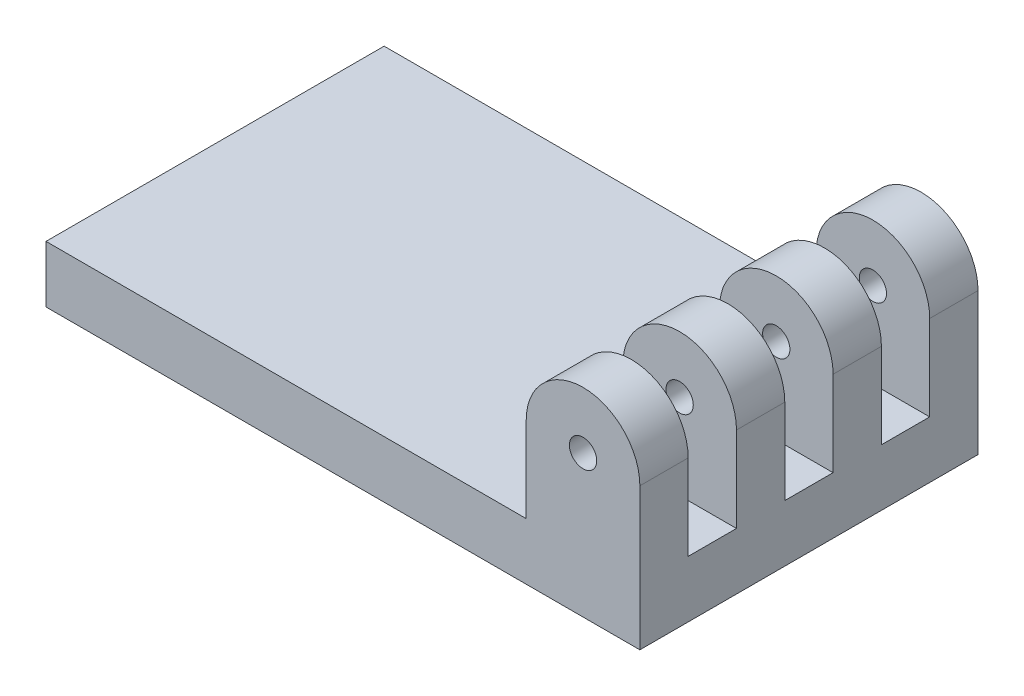
ISO-10303-21;
HEADER;
FILE_DESCRIPTION(('STEP AP214'),'2;1');
FILE_NAME('part.step','',(''),(''),'','','');
FILE_SCHEMA(('AUTOMOTIVE_DESIGN { 1 0 10303 214 1 1 1 1 }'));
ENDSEC;
DATA;
#1=APPLICATION_CONTEXT('core data for automotive mechanical design processes');
#2=APPLICATION_PROTOCOL_DEFINITION('international standard','automotive_design',2000,#1);
#3=PRODUCT_CONTEXT('',#1,'mechanical');
#4=PRODUCT('Part','Part','',(#3));
#5=PRODUCT_RELATED_PRODUCT_CATEGORY('part','',(#4));
#6=PRODUCT_DEFINITION_FORMATION('','',#4);
#7=PRODUCT_DEFINITION_CONTEXT('part definition',#1,'design');
#8=PRODUCT_DEFINITION('design','',#6,#7);
#9=PRODUCT_DEFINITION_SHAPE('','',#8);
#10=(LENGTH_UNIT() NAMED_UNIT(*) SI_UNIT(.MILLI.,.METRE.));
#11=(NAMED_UNIT(*) PLANE_ANGLE_UNIT() SI_UNIT($,.RADIAN.));
#12=(NAMED_UNIT(*) SI_UNIT($,.STERADIAN.) SOLID_ANGLE_UNIT());
#13=UNCERTAINTY_MEASURE_WITH_UNIT(LENGTH_MEASURE(1.E-05),#10,'distance_accuracy_value','');
#14=(GEOMETRIC_REPRESENTATION_CONTEXT(3) GLOBAL_UNCERTAINTY_ASSIGNED_CONTEXT((#13)) GLOBAL_UNIT_ASSIGNED_CONTEXT((#10,
#11,#12)) REPRESENTATION_CONTEXT('',''));
#15=CARTESIAN_POINT('',(0.,0.,0.));
#16=DIRECTION('',(0.,0.,1.));
#17=DIRECTION('',(1.,0.,0.));
#18=AXIS2_PLACEMENT_3D('',#15,#16,#17);
#19=CARTESIAN_POINT('',(52.25,10.,-29.75));
#20=DIRECTION('',(-1.,0.,0.));
#21=DIRECTION('',(0.,0.,1.));
#22=AXIS2_PLACEMENT_3D('',#19,#20,#21);
#23=PLANE('',#22);
#24=DIRECTION('',(0.,-1.,0.));
#25=VECTOR('',#24,1.);
#26=CARTESIAN_POINT('',(52.25,35.,-12.75));
#27=LINE('',#26,#25);
#28=CARTESIAN_POINT('',(52.25,25.,-12.75));
#29=VERTEX_POINT('',#28);
#30=CARTESIAN_POINT('',(52.25,10.,-12.75));
#31=VERTEX_POINT('',#30);
#32=EDGE_CURVE('E265',#29,#31,#27,.T.);
#33=ORIENTED_EDGE('',*,*,#32,.F.);
#34=DIRECTION('',(0.,0.,-1.));
#35=VECTOR('',#34,1.);
#36=CARTESIAN_POINT('',(52.25,25.,61.7656211871642));
#37=LINE('',#36,#35);
#38=CARTESIAN_POINT('',(52.25,25.,-4.25));
#39=VERTEX_POINT('',#38);
#40=EDGE_CURVE('E185',#39,#29,#37,.T.);
#41=ORIENTED_EDGE('',*,*,#40,.F.);
#42=DIRECTION('',(0.,-1.,0.));
#43=VECTOR('',#42,1.);
#44=CARTESIAN_POINT('',(52.25,35.,-4.25));
#45=LINE('',#44,#43);
#46=CARTESIAN_POINT('',(52.25,10.,-4.25));
#47=VERTEX_POINT('',#46);
#48=EDGE_CURVE('E262',#39,#47,#45,.T.);
#49=ORIENTED_EDGE('',*,*,#48,.T.);
#50=DIRECTION('',(0.,0.,-1.));
#51=VECTOR('',#50,1.);
#52=CARTESIAN_POINT('',(52.25,10.,-4.25));
#53=LINE('',#52,#51);
#54=CARTESIAN_POINT('',(52.25,10.,4.25));
#55=VERTEX_POINT('',#54);
#56=EDGE_CURVE('E290',#55,#47,#53,.T.);
#57=ORIENTED_EDGE('',*,*,#56,.F.);
#58=DIRECTION('',(0.,-1.,0.));
#59=VECTOR('',#58,1.);
#60=CARTESIAN_POINT('',(52.25,35.,4.25));
#61=LINE('',#60,#59);
#62=CARTESIAN_POINT('',(52.25,25.,4.25));
#63=VERTEX_POINT('',#62);
#64=EDGE_CURVE('E279',#63,#55,#61,.T.);
#65=ORIENTED_EDGE('',*,*,#64,.F.);
#66=CARTESIAN_POINT('',(52.25,25.,12.75));
#67=VERTEX_POINT('',#66);
#68=EDGE_CURVE('E249',#67,#63,#37,.T.);
#69=ORIENTED_EDGE('',*,*,#68,.F.);
#70=DIRECTION('',(0.,-1.,0.));
#71=VECTOR('',#70,1.);
#72=CARTESIAN_POINT('',(52.25,35.,12.75));
#73=LINE('',#72,#71);
#74=CARTESIAN_POINT('',(52.25,10.,12.75));
#75=VERTEX_POINT('',#74);
#76=EDGE_CURVE('E302',#67,#75,#73,.T.);
#77=ORIENTED_EDGE('',*,*,#76,.T.);
#78=DIRECTION('',(0.,0.,-1.));
#79=VECTOR('',#78,1.);
#80=CARTESIAN_POINT('',(52.25,10.,12.75));
#81=LINE('',#80,#79);
#82=CARTESIAN_POINT('',(52.25,10.,21.25));
#83=VERTEX_POINT('',#82);
#84=EDGE_CURVE('E309',#83,#75,#81,.T.);
#85=ORIENTED_EDGE('',*,*,#84,.F.);
#86=DIRECTION('',(0.,-1.,0.));
#87=VECTOR('',#86,1.);
#88=CARTESIAN_POINT('',(52.25,35.,21.25));
#89=LINE('',#88,#87);
#90=CARTESIAN_POINT('',(52.25,25.,21.25));
#91=VERTEX_POINT('',#90);
#92=EDGE_CURVE('E298',#91,#83,#89,.T.);
#93=ORIENTED_EDGE('',*,*,#92,.F.);
#94=CARTESIAN_POINT('',(52.25,25.,29.75));
#95=VERTEX_POINT('',#94);
#96=EDGE_CURVE('E102',#95,#91,#37,.T.);
#97=ORIENTED_EDGE('',*,*,#96,.F.);
#98=DIRECTION('',(0.,-1.,0.));
#99=VECTOR('',#98,1.);
#100=CARTESIAN_POINT('',(52.25,10.,29.75));
#101=LINE('',#100,#99);
#102=CARTESIAN_POINT('',(52.25,0.,29.75));
#103=VERTEX_POINT('',#102);
#104=EDGE_CURVE('E85',#95,#103,#101,.T.);
#105=ORIENTED_EDGE('',*,*,#104,.T.);
#106=DIRECTION('',(0.,0.,-1.));
#107=VECTOR('',#106,1.);
#108=CARTESIAN_POINT('',(52.25,0.,-29.75));
#109=LINE('',#108,#107);
#110=CARTESIAN_POINT('',(52.25,0.,-29.75));
#111=VERTEX_POINT('',#110);
#112=EDGE_CURVE('E99',#103,#111,#109,.T.);
#113=ORIENTED_EDGE('',*,*,#112,.T.);
#114=DIRECTION('',(0.,-1.,0.));
#115=VECTOR('',#114,1.);
#116=CARTESIAN_POINT('',(52.25,10.,-29.75));
#117=LINE('',#116,#115);
#118=CARTESIAN_POINT('',(52.25,25.,-29.75));
#119=VERTEX_POINT('',#118);
#120=EDGE_CURVE('E122',#119,#111,#117,.T.);
#121=ORIENTED_EDGE('',*,*,#120,.F.);
#122=CARTESIAN_POINT('',(52.25,25.,-21.25));
#123=VERTEX_POINT('',#122);
#124=EDGE_CURVE('E179',#123,#119,#37,.T.);
#125=ORIENTED_EDGE('',*,*,#124,.F.);
#126=DIRECTION('',(0.,-1.,0.));
#127=VECTOR('',#126,1.);
#128=CARTESIAN_POINT('',(52.25,35.,-21.25));
#129=LINE('',#128,#127);
#130=CARTESIAN_POINT('',(52.25,10.,-21.25));
#131=VERTEX_POINT('',#130);
#132=EDGE_CURVE('E149',#123,#131,#129,.T.);
#133=ORIENTED_EDGE('',*,*,#132,.T.);
#134=DIRECTION('',(0.,0.,-1.));
#135=VECTOR('',#134,1.);
#136=CARTESIAN_POINT('',(52.25,10.,-21.25));
#137=LINE('',#136,#135);
#138=EDGE_CURVE('E268',#31,#131,#137,.T.);
#139=ORIENTED_EDGE('',*,*,#138,.F.);
#140=EDGE_LOOP('',(#33,#41,#49,#57,#65,#69,#77,#85,#93,#97,#105,#113,#121,#125,#133,#139));
#141=FACE_BOUND('',#140,.T.);
#142=ADVANCED_FACE('F39',(#141),#23,.F.);
#143=CARTESIAN_POINT('',(32.25,10.,61.7656211871642));
#144=DIRECTION('',(1.,0.,0.));
#145=DIRECTION('',(0.,1.,0.));
#146=AXIS2_PLACEMENT_3D('',#143,#144,#145);
#147=PLANE('',#146);
#148=DIRECTION('',(0.,-1.,0.));
#149=VECTOR('',#148,1.);
#150=CARTESIAN_POINT('',(32.25,35.,-12.75));
#151=LINE('',#150,#149);
#152=CARTESIAN_POINT('',(32.25,25.,-12.75));
#153=VERTEX_POINT('',#152);
#154=CARTESIAN_POINT('',(32.25,10.,-12.75));
#155=VERTEX_POINT('',#154);
#156=EDGE_CURVE('E272',#153,#155,#151,.T.);
#157=ORIENTED_EDGE('',*,*,#156,.T.);
#158=DIRECTION('',(0.,0.,-1.));
#159=VECTOR('',#158,1.);
#160=CARTESIAN_POINT('',(32.25,10.,61.7656211871642));
#161=LINE('',#160,#159);
#162=CARTESIAN_POINT('',(32.25,10.,-4.25));
#163=VERTEX_POINT('',#162);
#164=EDGE_CURVE('E317',#163,#155,#161,.T.);
#165=ORIENTED_EDGE('',*,*,#164,.F.);
#166=DIRECTION('',(0.,-1.,0.));
#167=VECTOR('',#166,1.);
#168=CARTESIAN_POINT('',(32.25,35.,-4.25));
#169=LINE('',#168,#167);
#170=CARTESIAN_POINT('',(32.25,25.,-4.25));
#171=VERTEX_POINT('',#170);
#172=EDGE_CURVE('E284',#171,#163,#169,.T.);
#173=ORIENTED_EDGE('',*,*,#172,.F.);
#174=DIRECTION('',(0.,0.,-1.));
#175=VECTOR('',#174,1.);
#176=CARTESIAN_POINT('',(32.25,25.,61.7656211871642));
#177=LINE('',#176,#175);
#178=EDGE_CURVE('E168',#171,#153,#177,.T.);
#179=ORIENTED_EDGE('',*,*,#178,.T.);
#180=EDGE_LOOP('',(#157,#165,#173,#179));
#181=FACE_BOUND('',#180,.T.);
#182=ADVANCED_FACE('F345',(#181),#147,.F.);
#183=DIRECTION('',(0.,-1.,0.));
#184=VECTOR('',#183,1.);
#185=CARTESIAN_POINT('',(32.25,35.,-21.25));
#186=LINE('',#185,#184);
#187=CARTESIAN_POINT('',(32.25,25.,-21.25));
#188=VERTEX_POINT('',#187);
#189=CARTESIAN_POINT('',(32.25,10.,-21.25));
#190=VERTEX_POINT('',#189);
#191=EDGE_CURVE('E146',#188,#190,#186,.T.);
#192=ORIENTED_EDGE('',*,*,#191,.F.);
#193=CARTESIAN_POINT('',(32.25,25.,-29.75));
#194=VERTEX_POINT('',#193);
#195=EDGE_CURVE('E160',#188,#194,#177,.T.);
#196=ORIENTED_EDGE('',*,*,#195,.T.);
#197=DIRECTION('',(0.,1.,0.));
#198=VECTOR('',#197,1.);
#199=CARTESIAN_POINT('',(32.25,10.,-29.75));
#200=LINE('',#199,#198);
#201=CARTESIAN_POINT('',(32.25,10.,-29.75));
#202=VERTEX_POINT('',#201);
#203=EDGE_CURVE('E314',#202,#194,#200,.T.);
#204=ORIENTED_EDGE('',*,*,#203,.F.);
#205=EDGE_CURVE('E54',#190,#202,#161,.T.);
#206=ORIENTED_EDGE('',*,*,#205,.F.);
#207=EDGE_LOOP('',(#192,#196,#204,#206));
#208=FACE_BOUND('',#207,.T.);
#209=ADVANCED_FACE('F158',(#208),#147,.F.);
#210=DIRECTION('',(0.,-1.,0.));
#211=VECTOR('',#210,1.);
#212=CARTESIAN_POINT('',(32.25,35.,4.25));
#213=LINE('',#212,#211);
#214=CARTESIAN_POINT('',(32.25,25.,4.25));
#215=VERTEX_POINT('',#214);
#216=CARTESIAN_POINT('',(32.25,10.,4.25));
#217=VERTEX_POINT('',#216);
#218=EDGE_CURVE('E195',#215,#217,#213,.T.);
#219=ORIENTED_EDGE('',*,*,#218,.T.);
#220=CARTESIAN_POINT('',(32.25,10.,12.75));
#221=VERTEX_POINT('',#220);
#222=EDGE_CURVE('E175',#221,#217,#161,.T.);
#223=ORIENTED_EDGE('',*,*,#222,.F.);
#224=DIRECTION('',(0.,-1.,0.));
#225=VECTOR('',#224,1.);
#226=CARTESIAN_POINT('',(32.25,35.,12.75));
#227=LINE('',#226,#225);
#228=CARTESIAN_POINT('',(32.25,25.,12.75));
#229=VERTEX_POINT('',#228);
#230=EDGE_CURVE('E199',#229,#221,#227,.T.);
#231=ORIENTED_EDGE('',*,*,#230,.F.);
#232=EDGE_CURVE('E173',#229,#215,#177,.T.);
#233=ORIENTED_EDGE('',*,*,#232,.T.);
#234=EDGE_LOOP('',(#219,#223,#231,#233));
#235=FACE_BOUND('',#234,.T.);
#236=ADVANCED_FACE('F191',(#235),#147,.F.);
#237=DIRECTION('',(0.,-1.,0.));
#238=VECTOR('',#237,1.);
#239=CARTESIAN_POINT('',(32.25,35.,21.25));
#240=LINE('',#239,#238);
#241=CARTESIAN_POINT('',(32.25,25.,21.25));
#242=VERTEX_POINT('',#241);
#243=CARTESIAN_POINT('',(32.25,10.,21.25));
#244=VERTEX_POINT('',#243);
#245=EDGE_CURVE('E245',#242,#244,#240,.T.);
#246=ORIENTED_EDGE('',*,*,#245,.T.);
#247=CARTESIAN_POINT('',(32.25,10.,29.75));
#248=VERTEX_POINT('',#247);
#249=EDGE_CURVE('E169',#248,#244,#161,.T.);
#250=ORIENTED_EDGE('',*,*,#249,.F.);
#251=DIRECTION('',(0.,1.,0.));
#252=VECTOR('',#251,1.);
#253=CARTESIAN_POINT('',(32.25,10.,29.75));
#254=LINE('',#253,#252);
#255=CARTESIAN_POINT('',(32.25,25.,29.75));
#256=VERTEX_POINT('',#255);
#257=EDGE_CURVE('E112',#248,#256,#254,.T.);
#258=ORIENTED_EDGE('',*,*,#257,.T.);
#259=EDGE_CURVE('E171',#256,#242,#177,.T.);
#260=ORIENTED_EDGE('',*,*,#259,.T.);
#261=EDGE_LOOP('',(#246,#250,#258,#260));
#262=FACE_BOUND('',#261,.T.);
#263=ADVANCED_FACE('F243',(#262),#147,.F.);
#264=CARTESIAN_POINT('',(42.25,25.,61.7656211871642));
#265=DIRECTION('',(0.,0.,-1.));
#266=DIRECTION('',(-1.,0.,0.));
#267=AXIS2_PLACEMENT_3D('',#264,#265,#266);
#268=CYLINDRICAL_SURFACE('',#267,10.);
#269=CARTESIAN_POINT('',(42.25,25.,-12.75));
#270=DIRECTION('',(0.,0.,-1.));
#271=DIRECTION('',(-1.,0.,0.));
#272=AXIS2_PLACEMENT_3D('',#269,#270,#271);
#273=CIRCLE('',#272,10.);
#274=EDGE_CURVE('E11',#153,#29,#273,.T.);
#275=ORIENTED_EDGE('',*,*,#274,.F.);
#276=ORIENTED_EDGE('',*,*,#178,.F.);
#277=CARTESIAN_POINT('',(42.25,25.,-4.25));
#278=DIRECTION('',(0.,0.,1.));
#279=DIRECTION('',(1.,0.,0.));
#280=AXIS2_PLACEMENT_3D('',#277,#278,#279);
#281=CIRCLE('',#280,10.);
#282=EDGE_CURVE('E130',#39,#171,#281,.T.);
#283=ORIENTED_EDGE('',*,*,#282,.F.);
#284=ORIENTED_EDGE('',*,*,#40,.T.);
#285=EDGE_LOOP('',(#275,#276,#283,#284));
#286=FACE_BOUND('',#285,.T.);
#287=ADVANCED_FACE('F255',(#286),#268,.T.);
#288=CARTESIAN_POINT('',(42.25,25.,-21.25));
#289=DIRECTION('',(0.,0.,1.));
#290=DIRECTION('',(1.,0.,0.));
#291=AXIS2_PLACEMENT_3D('',#288,#289,#290);
#292=CIRCLE('',#291,10.);
#293=EDGE_CURVE('E47',#123,#188,#292,.T.);
#294=ORIENTED_EDGE('',*,*,#293,.F.);
#295=ORIENTED_EDGE('',*,*,#124,.T.);
#296=CARTESIAN_POINT('',(42.25,25.,-29.75));
#297=DIRECTION('',(0.,0.,1.));
#298=DIRECTION('',(1.,0.,0.));
#299=AXIS2_PLACEMENT_3D('',#296,#297,#298);
#300=CIRCLE('',#299,10.);
#301=EDGE_CURVE('E167',#194,#119,#300,.F.);
#302=ORIENTED_EDGE('',*,*,#301,.F.);
#303=ORIENTED_EDGE('',*,*,#195,.F.);
#304=EDGE_LOOP('',(#294,#295,#302,#303));
#305=FACE_BOUND('',#304,.T.);
#306=ADVANCED_FACE('F165',(#305),#268,.T.);
#307=CARTESIAN_POINT('',(42.25,25.,4.25));
#308=DIRECTION('',(0.,0.,-1.));
#309=DIRECTION('',(-1.,0.,0.));
#310=AXIS2_PLACEMENT_3D('',#307,#308,#309);
#311=CIRCLE('',#310,10.);
#312=EDGE_CURVE('E133',#215,#63,#311,.T.);
#313=ORIENTED_EDGE('',*,*,#312,.F.);
#314=ORIENTED_EDGE('',*,*,#232,.F.);
#315=CARTESIAN_POINT('',(42.25,25.,12.75));
#316=DIRECTION('',(0.,0.,1.));
#317=DIRECTION('',(1.,0.,0.));
#318=AXIS2_PLACEMENT_3D('',#315,#316,#317);
#319=CIRCLE('',#318,10.);
#320=EDGE_CURVE('E124',#67,#229,#319,.T.);
#321=ORIENTED_EDGE('',*,*,#320,.F.);
#322=ORIENTED_EDGE('',*,*,#68,.T.);
#323=EDGE_LOOP('',(#313,#314,#321,#322));
#324=FACE_BOUND('',#323,.T.);
#325=ADVANCED_FACE('F205',(#324),#268,.T.);
#326=CARTESIAN_POINT('',(42.25,25.,21.25));
#327=DIRECTION('',(0.,0.,-1.));
#328=DIRECTION('',(-1.,0.,0.));
#329=AXIS2_PLACEMENT_3D('',#326,#327,#328);
#330=CIRCLE('',#329,10.);
#331=EDGE_CURVE('E127',#242,#91,#330,.T.);
#332=ORIENTED_EDGE('',*,*,#331,.F.);
#333=ORIENTED_EDGE('',*,*,#259,.F.);
#334=CARTESIAN_POINT('',(42.25,25.,29.75));
#335=DIRECTION('',(0.,0.,-1.));
#336=DIRECTION('',(-1.,0.,0.));
#337=AXIS2_PLACEMENT_3D('',#334,#335,#336);
#338=CIRCLE('',#337,10.);
#339=EDGE_CURVE('E109',#256,#95,#338,.T.);
#340=ORIENTED_EDGE('',*,*,#339,.T.);
#341=ORIENTED_EDGE('',*,*,#96,.T.);
#342=EDGE_LOOP('',(#332,#333,#340,#341));
#343=FACE_BOUND('',#342,.T.);
#344=ADVANCED_FACE('F365',(#343),#268,.T.);
#345=CARTESIAN_POINT('',(0.,10.,0.));
#346=DIRECTION('',(0.,1.,0.));
#347=DIRECTION('',(0.,0.,1.));
#348=AXIS2_PLACEMENT_3D('',#345,#346,#347);
#349=PLANE('',#348);
#350=DIRECTION('',(1.,0.,0.));
#351=VECTOR('',#350,1.);
#352=CARTESIAN_POINT('',(-52.25,10.,29.75));
#353=LINE('',#352,#351);
#354=CARTESIAN_POINT('',(-52.25,10.,29.75));
#355=VERTEX_POINT('',#354);
#356=EDGE_CURVE('E104',#355,#248,#353,.T.);
#357=ORIENTED_EDGE('',*,*,#356,.T.);
#358=ORIENTED_EDGE('',*,*,#249,.T.);
#359=DIRECTION('',(1.,0.,0.));
#360=VECTOR('',#359,1.);
#361=CARTESIAN_POINT('',(32.25,10.,21.25));
#362=LINE('',#361,#360);
#363=EDGE_CURVE('E280',#244,#83,#362,.T.);
#364=ORIENTED_EDGE('',*,*,#363,.T.);
#365=ORIENTED_EDGE('',*,*,#84,.T.);
#366=DIRECTION('',(-1.,0.,0.));
#367=VECTOR('',#366,1.);
#368=CARTESIAN_POINT('',(32.25,10.,12.75));
#369=LINE('',#368,#367);
#370=EDGE_CURVE('E306',#75,#221,#369,.T.);
#371=ORIENTED_EDGE('',*,*,#370,.T.);
#372=ORIENTED_EDGE('',*,*,#222,.T.);
#373=DIRECTION('',(1.,0.,0.));
#374=VECTOR('',#373,1.);
#375=CARTESIAN_POINT('',(32.25,10.,4.25));
#376=LINE('',#375,#374);
#377=EDGE_CURVE('E293',#217,#55,#376,.T.);
#378=ORIENTED_EDGE('',*,*,#377,.T.);
#379=ORIENTED_EDGE('',*,*,#56,.T.);
#380=DIRECTION('',(-1.,0.,0.));
#381=VECTOR('',#380,1.);
#382=CARTESIAN_POINT('',(32.25,10.,-4.25));
#383=LINE('',#382,#381);
#384=EDGE_CURVE('E287',#47,#163,#383,.T.);
#385=ORIENTED_EDGE('',*,*,#384,.T.);
#386=ORIENTED_EDGE('',*,*,#164,.T.);
#387=DIRECTION('',(1.,0.,0.));
#388=VECTOR('',#387,1.);
#389=CARTESIAN_POINT('',(32.25,10.,-12.75));
#390=LINE('',#389,#388);
#391=EDGE_CURVE('E296',#155,#31,#390,.T.);
#392=ORIENTED_EDGE('',*,*,#391,.T.);
#393=ORIENTED_EDGE('',*,*,#138,.T.);
#394=DIRECTION('',(-1.,0.,0.));
#395=VECTOR('',#394,1.);
#396=CARTESIAN_POINT('',(32.25,10.,-21.25));
#397=LINE('',#396,#395);
#398=EDGE_CURVE('E162',#131,#190,#397,.T.);
#399=ORIENTED_EDGE('',*,*,#398,.T.);
#400=ORIENTED_EDGE('',*,*,#205,.T.);
#401=DIRECTION('',(-1.,0.,0.));
#402=VECTOR('',#401,1.);
#403=CARTESIAN_POINT('',(-52.25,10.,-29.75));
#404=LINE('',#403,#402);
#405=CARTESIAN_POINT('',(-52.25,10.,-29.75));
#406=VERTEX_POINT('',#405);
#407=EDGE_CURVE('E92',#202,#406,#404,.T.);
#408=ORIENTED_EDGE('',*,*,#407,.T.);
#409=DIRECTION('',(0.,0.,1.));
#410=VECTOR('',#409,1.);
#411=CARTESIAN_POINT('',(-52.25,10.,-29.75));
#412=LINE('',#411,#410);
#413=EDGE_CURVE('E61',#406,#355,#412,.T.);
#414=ORIENTED_EDGE('',*,*,#413,.T.);
#415=EDGE_LOOP('',(#357,#358,#364,#365,#371,#372,#378,#379,#385,#386,#392,#393,#399,#400,#408,#414));
#416=FACE_BOUND('',#415,.T.);
#417=ADVANCED_FACE('F247',(#416),#349,.T.);
#418=CARTESIAN_POINT('',(-52.25,10.,-29.75));
#419=DIRECTION('',(0.,0.,1.));
#420=DIRECTION('',(1.,0.,0.));
#421=AXIS2_PLACEMENT_3D('',#418,#419,#420);
#422=PLANE('',#421);
#423=CARTESIAN_POINT('',(42.25,25.,-29.75));
#424=DIRECTION('',(0.,0.,1.));
#425=DIRECTION('',(1.,0.,0.));
#426=AXIS2_PLACEMENT_3D('',#423,#424,#425);
#427=CIRCLE('',#426,2.39999999999999);
#428=CARTESIAN_POINT('',(44.65,25.,-29.75));
#429=VERTEX_POINT('',#428);
#430=EDGE_CURVE('E573',#429,#429,#427,.T.);
#431=ORIENTED_EDGE('',*,*,#430,.T.);
#432=EDGE_LOOP('',(#431));
#433=FACE_BOUND('',#432,.T.);
#434=DIRECTION('',(-1.,0.,0.));
#435=VECTOR('',#434,1.);
#436=CARTESIAN_POINT('',(-52.25,0.,-29.75));
#437=LINE('',#436,#435);
#438=CARTESIAN_POINT('',(-52.25,0.,-29.75));
#439=VERTEX_POINT('',#438);
#440=EDGE_CURVE('E107',#111,#439,#437,.T.);
#441=ORIENTED_EDGE('',*,*,#440,.T.);
#442=DIRECTION('',(0.,-1.,0.));
#443=VECTOR('',#442,1.);
#444=CARTESIAN_POINT('',(-52.25,10.,-29.75));
#445=LINE('',#444,#443);
#446=EDGE_CURVE('E119',#406,#439,#445,.T.);
#447=ORIENTED_EDGE('',*,*,#446,.F.);
#448=ORIENTED_EDGE('',*,*,#407,.F.);
#449=ORIENTED_EDGE('',*,*,#203,.T.);
#450=ORIENTED_EDGE('',*,*,#301,.T.);
#451=ORIENTED_EDGE('',*,*,#120,.T.);
#452=EDGE_LOOP('',(#441,#447,#448,#449,#450,#451));
#453=FACE_BOUND('',#452,.T.);
#454=ADVANCED_FACE('F353',(#433,#453),#422,.F.);
#455=CARTESIAN_POINT('',(-52.25,10.,-29.75));
#456=DIRECTION('',(1.,0.,0.));
#457=DIRECTION('',(0.,0.,-1.));
#458=AXIS2_PLACEMENT_3D('',#455,#456,#457);
#459=PLANE('',#458);
#460=DIRECTION('',(0.,0.,1.));
#461=VECTOR('',#460,1.);
#462=CARTESIAN_POINT('',(-52.25,0.,-29.75));
#463=LINE('',#462,#461);
#464=CARTESIAN_POINT('',(-52.25,0.,29.75));
#465=VERTEX_POINT('',#464);
#466=EDGE_CURVE('E93',#439,#465,#463,.T.);
#467=ORIENTED_EDGE('',*,*,#466,.T.);
#468=DIRECTION('',(0.,-1.,0.));
#469=VECTOR('',#468,1.);
#470=CARTESIAN_POINT('',(-52.25,10.,29.75));
#471=LINE('',#470,#469);
#472=EDGE_CURVE('E88',#355,#465,#471,.T.);
#473=ORIENTED_EDGE('',*,*,#472,.F.);
#474=ORIENTED_EDGE('',*,*,#413,.F.);
#475=ORIENTED_EDGE('',*,*,#446,.T.);
#476=EDGE_LOOP('',(#467,#473,#474,#475));
#477=FACE_BOUND('',#476,.T.);
#478=ADVANCED_FACE('F356',(#477),#459,.F.);
#479=CARTESIAN_POINT('',(-52.25,10.,29.75));
#480=DIRECTION('',(0.,0.,-1.));
#481=DIRECTION('',(-1.,0.,0.));
#482=AXIS2_PLACEMENT_3D('',#479,#480,#481);
#483=PLANE('',#482);
#484=CARTESIAN_POINT('',(42.25,25.,29.75));
#485=DIRECTION('',(0.,0.,1.));
#486=DIRECTION('',(1.,0.,0.));
#487=AXIS2_PLACEMENT_3D('',#484,#485,#486);
#488=CIRCLE('',#487,2.39999999999999);
#489=CARTESIAN_POINT('',(44.65,25.,29.75));
#490=VERTEX_POINT('',#489);
#491=EDGE_CURVE('E571',#490,#490,#488,.T.);
#492=ORIENTED_EDGE('',*,*,#491,.F.);
#493=EDGE_LOOP('',(#492));
#494=FACE_BOUND('',#493,.T.);
#495=DIRECTION('',(1.,0.,0.));
#496=VECTOR('',#495,1.);
#497=CARTESIAN_POINT('',(-52.25,0.,29.75));
#498=LINE('',#497,#496);
#499=EDGE_CURVE('E81',#465,#103,#498,.T.);
#500=ORIENTED_EDGE('',*,*,#499,.T.);
#501=ORIENTED_EDGE('',*,*,#104,.F.);
#502=ORIENTED_EDGE('',*,*,#339,.F.);
#503=ORIENTED_EDGE('',*,*,#257,.F.);
#504=ORIENTED_EDGE('',*,*,#356,.F.);
#505=ORIENTED_EDGE('',*,*,#472,.T.);
#506=EDGE_LOOP('',(#500,#501,#502,#503,#504,#505));
#507=FACE_BOUND('',#506,.T.);
#508=ADVANCED_FACE('F83',(#494,#507),#483,.F.);
#509=CARTESIAN_POINT('',(0.,0.,0.));
#510=DIRECTION('',(0.,1.,0.));
#511=DIRECTION('',(0.,0.,1.));
#512=AXIS2_PLACEMENT_3D('',#509,#510,#511);
#513=PLANE('',#512);
#514=ORIENTED_EDGE('',*,*,#112,.F.);
#515=ORIENTED_EDGE('',*,*,#499,.F.);
#516=ORIENTED_EDGE('',*,*,#466,.F.);
#517=ORIENTED_EDGE('',*,*,#440,.F.);
#518=EDGE_LOOP('',(#514,#515,#516,#517));
#519=FACE_BOUND('',#518,.T.);
#520=ADVANCED_FACE('F106',(#519),#513,.F.);
#521=CARTESIAN_POINT('',(32.25,35.,21.25));
#522=DIRECTION('',(0.,0.,-1.));
#523=DIRECTION('',(-1.,0.,0.));
#524=AXIS2_PLACEMENT_3D('',#521,#522,#523);
#525=PLANE('',#524);
#526=CARTESIAN_POINT('',(42.25,25.,21.25));
#527=DIRECTION('',(0.,0.,-1.));
#528=DIRECTION('',(-1.,0.,0.));
#529=AXIS2_PLACEMENT_3D('',#526,#527,#528);
#530=CIRCLE('',#529,2.39999999999999);
#531=CARTESIAN_POINT('',(39.85,25.,21.25));
#532=VERTEX_POINT('',#531);
#533=EDGE_CURVE('E299',#532,#532,#530,.T.);
#534=ORIENTED_EDGE('',*,*,#533,.F.);
#535=EDGE_LOOP('',(#534));
#536=FACE_BOUND('',#535,.T.);
#537=ORIENTED_EDGE('',*,*,#245,.F.);
#538=ORIENTED_EDGE('',*,*,#331,.T.);
#539=ORIENTED_EDGE('',*,*,#92,.T.);
#540=ORIENTED_EDGE('',*,*,#363,.F.);
#541=EDGE_LOOP('',(#537,#538,#539,#540));
#542=FACE_BOUND('',#541,.T.);
#543=ADVANCED_FACE('F408',(#536,#542),#525,.T.);
#544=CARTESIAN_POINT('',(32.25,35.,12.75));
#545=DIRECTION('',(0.,0.,1.));
#546=DIRECTION('',(1.,0.,0.));
#547=AXIS2_PLACEMENT_3D('',#544,#545,#546);
#548=PLANE('',#547);
#549=CARTESIAN_POINT('',(42.25,25.,12.75));
#550=DIRECTION('',(0.,0.,1.));
#551=DIRECTION('',(1.,0.,0.));
#552=AXIS2_PLACEMENT_3D('',#549,#550,#551);
#553=CIRCLE('',#552,2.39999999999999);
#554=CARTESIAN_POINT('',(44.65,25.,12.75));
#555=VERTEX_POINT('',#554);
#556=EDGE_CURVE('E585',#555,#555,#553,.T.);
#557=ORIENTED_EDGE('',*,*,#556,.F.);
#558=EDGE_LOOP('',(#557));
#559=FACE_BOUND('',#558,.T.);
#560=ORIENTED_EDGE('',*,*,#76,.F.);
#561=ORIENTED_EDGE('',*,*,#320,.T.);
#562=ORIENTED_EDGE('',*,*,#230,.T.);
#563=ORIENTED_EDGE('',*,*,#370,.F.);
#564=EDGE_LOOP('',(#560,#561,#562,#563));
#565=FACE_BOUND('',#564,.T.);
#566=ADVANCED_FACE('F413',(#559,#565),#548,.T.);
#567=CARTESIAN_POINT('',(32.25,35.,4.25));
#568=DIRECTION('',(0.,0.,-1.));
#569=DIRECTION('',(-1.,0.,0.));
#570=AXIS2_PLACEMENT_3D('',#567,#568,#569);
#571=PLANE('',#570);
#572=CARTESIAN_POINT('',(42.25,25.,4.25));
#573=DIRECTION('',(0.,0.,-1.));
#574=DIRECTION('',(-1.,0.,0.));
#575=AXIS2_PLACEMENT_3D('',#572,#573,#574);
#576=CIRCLE('',#575,2.39999999999999);
#577=CARTESIAN_POINT('',(39.85,25.,4.25));
#578=VERTEX_POINT('',#577);
#579=EDGE_CURVE('E580',#578,#578,#576,.T.);
#580=ORIENTED_EDGE('',*,*,#579,.F.);
#581=EDGE_LOOP('',(#580));
#582=FACE_BOUND('',#581,.T.);
#583=ORIENTED_EDGE('',*,*,#218,.F.);
#584=ORIENTED_EDGE('',*,*,#312,.T.);
#585=ORIENTED_EDGE('',*,*,#64,.T.);
#586=ORIENTED_EDGE('',*,*,#377,.F.);
#587=EDGE_LOOP('',(#583,#584,#585,#586));
#588=FACE_BOUND('',#587,.T.);
#589=ADVANCED_FACE('F342',(#582,#588),#571,.T.);
#590=CARTESIAN_POINT('',(32.25,35.,-4.25));
#591=DIRECTION('',(0.,0.,1.));
#592=DIRECTION('',(1.,0.,0.));
#593=AXIS2_PLACEMENT_3D('',#590,#591,#592);
#594=PLANE('',#593);
#595=CARTESIAN_POINT('',(42.25,25.,-4.25));
#596=DIRECTION('',(0.,0.,1.));
#597=DIRECTION('',(1.,0.,0.));
#598=AXIS2_PLACEMENT_3D('',#595,#596,#597);
#599=CIRCLE('',#598,2.39999999999999);
#600=CARTESIAN_POINT('',(44.65,25.,-4.25));
#601=VERTEX_POINT('',#600);
#602=EDGE_CURVE('E583',#601,#601,#599,.T.);
#603=ORIENTED_EDGE('',*,*,#602,.F.);
#604=EDGE_LOOP('',(#603));
#605=FACE_BOUND('',#604,.T.);
#606=ORIENTED_EDGE('',*,*,#48,.F.);
#607=ORIENTED_EDGE('',*,*,#282,.T.);
#608=ORIENTED_EDGE('',*,*,#172,.T.);
#609=ORIENTED_EDGE('',*,*,#384,.F.);
#610=EDGE_LOOP('',(#606,#607,#608,#609));
#611=FACE_BOUND('',#610,.T.);
#612=ADVANCED_FACE('F343',(#605,#611),#594,.T.);
#613=CARTESIAN_POINT('',(32.25,35.,-12.75));
#614=DIRECTION('',(0.,0.,-1.));
#615=DIRECTION('',(-1.,0.,0.));
#616=AXIS2_PLACEMENT_3D('',#613,#614,#615);
#617=PLANE('',#616);
#618=CARTESIAN_POINT('',(42.25,25.,-12.75));
#619=DIRECTION('',(0.,0.,-1.));
#620=DIRECTION('',(-1.,0.,0.));
#621=AXIS2_PLACEMENT_3D('',#618,#619,#620);
#622=CIRCLE('',#621,2.39999999999999);
#623=CARTESIAN_POINT('',(39.85,25.,-12.75));
#624=VERTEX_POINT('',#623);
#625=EDGE_CURVE('E577',#624,#624,#622,.T.);
#626=ORIENTED_EDGE('',*,*,#625,.F.);
#627=EDGE_LOOP('',(#626));
#628=FACE_BOUND('',#627,.T.);
#629=ORIENTED_EDGE('',*,*,#156,.F.);
#630=ORIENTED_EDGE('',*,*,#274,.T.);
#631=ORIENTED_EDGE('',*,*,#32,.T.);
#632=ORIENTED_EDGE('',*,*,#391,.F.);
#633=EDGE_LOOP('',(#629,#630,#631,#632));
#634=FACE_BOUND('',#633,.T.);
#635=ADVANCED_FACE('F347',(#628,#634),#617,.T.);
#636=CARTESIAN_POINT('',(32.25,35.,-21.25));
#637=DIRECTION('',(0.,0.,1.));
#638=DIRECTION('',(1.,0.,0.));
#639=AXIS2_PLACEMENT_3D('',#636,#637,#638);
#640=PLANE('',#639);
#641=CARTESIAN_POINT('',(42.25,25.,-21.25));
#642=DIRECTION('',(0.,0.,1.));
#643=DIRECTION('',(1.,0.,0.));
#644=AXIS2_PLACEMENT_3D('',#641,#642,#643);
#645=CIRCLE('',#644,2.39999999999999);
#646=CARTESIAN_POINT('',(44.65,25.,-21.25));
#647=VERTEX_POINT('',#646);
#648=EDGE_CURVE('E42',#647,#647,#645,.T.);
#649=ORIENTED_EDGE('',*,*,#648,.F.);
#650=EDGE_LOOP('',(#649));
#651=FACE_BOUND('',#650,.T.);
#652=ORIENTED_EDGE('',*,*,#132,.F.);
#653=ORIENTED_EDGE('',*,*,#293,.T.);
#654=ORIENTED_EDGE('',*,*,#191,.T.);
#655=ORIENTED_EDGE('',*,*,#398,.F.);
#656=EDGE_LOOP('',(#652,#653,#654,#655));
#657=FACE_BOUND('',#656,.T.);
#658=ADVANCED_FACE('F143',(#651,#657),#640,.T.);
#659=CARTESIAN_POINT('',(42.25,25.,29.75));
#660=DIRECTION('',(0.,0.,1.));
#661=DIRECTION('',(1.,0.,0.));
#662=AXIS2_PLACEMENT_3D('',#659,#660,#661);
#663=CYLINDRICAL_SURFACE('',#662,2.39999999999999);
#664=ORIENTED_EDGE('',*,*,#648,.T.);
#665=EDGE_LOOP('',(#664));
#666=FACE_BOUND('',#665,.T.);
#667=ORIENTED_EDGE('',*,*,#430,.F.);
#668=EDGE_LOOP('',(#667));
#669=FACE_BOUND('',#668,.T.);
#670=ADVANCED_FACE('F453',(#666,#669),#663,.F.);
#671=ORIENTED_EDGE('',*,*,#602,.T.);
#672=EDGE_LOOP('',(#671));
#673=FACE_BOUND('',#672,.T.);
#674=ORIENTED_EDGE('',*,*,#625,.T.);
#675=EDGE_LOOP('',(#674));
#676=FACE_BOUND('',#675,.T.);
#677=ADVANCED_FACE('F462',(#673,#676),#663,.F.);
#678=ORIENTED_EDGE('',*,*,#556,.T.);
#679=EDGE_LOOP('',(#678));
#680=FACE_BOUND('',#679,.T.);
#681=ORIENTED_EDGE('',*,*,#579,.T.);
#682=EDGE_LOOP('',(#681));
#683=FACE_BOUND('',#682,.T.);
#684=ADVANCED_FACE('F466',(#680,#683),#663,.F.);
#685=ORIENTED_EDGE('',*,*,#533,.T.);
#686=EDGE_LOOP('',(#685));
#687=FACE_BOUND('',#686,.T.);
#688=ORIENTED_EDGE('',*,*,#491,.T.);
#689=EDGE_LOOP('',(#688));
#690=FACE_BOUND('',#689,.T.);
#691=ADVANCED_FACE('F465',(#687,#690),#663,.F.);
#692=CLOSED_SHELL('',(#142,#182,#209,#236,#263,#287,#306,#325,#344,#417,#454,#478,#508,#520,
#543,#566,#589,#612,#635,#658,#670,#677,#684,#691));
#693=MANIFOLD_SOLID_BREP('B2',#692);
#694=ADVANCED_BREP_SHAPE_REPRESENTATION('',(#18,#693),#14);
#695=SHAPE_DEFINITION_REPRESENTATION(#9,#694);
ENDSEC;
END-ISO-10303-21;
